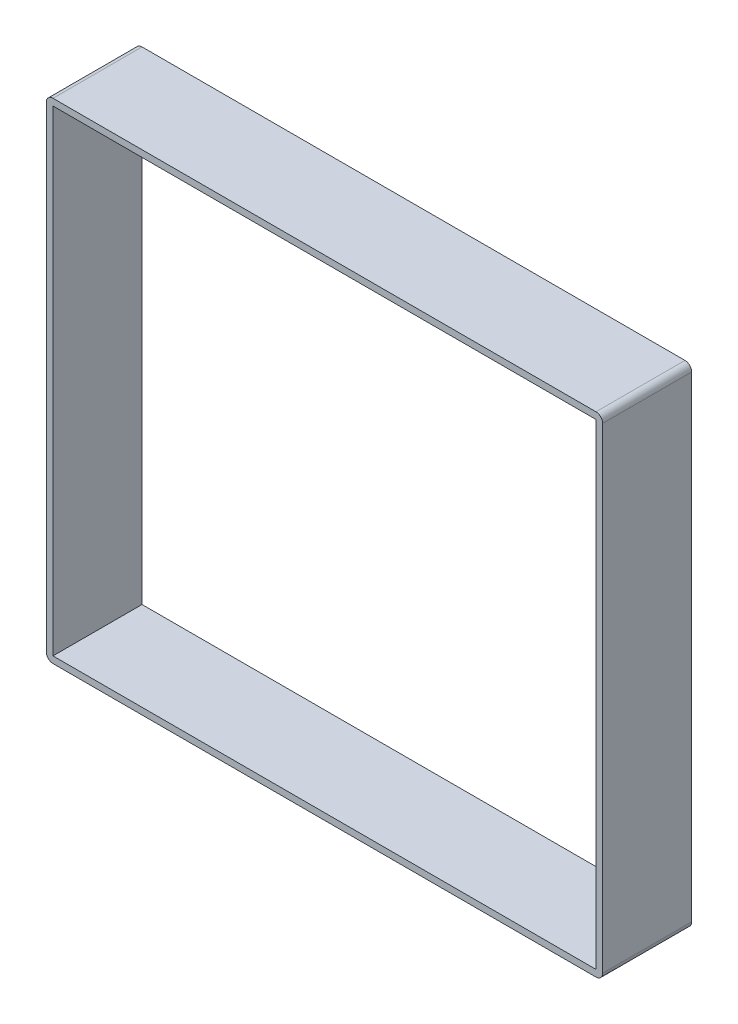
ISO-10303-21;
HEADER;
FILE_DESCRIPTION(('STEP AP214'),'2;1');
FILE_NAME('part.step','',(''),(''),'','','');
FILE_SCHEMA(('AUTOMOTIVE_DESIGN { 1 0 10303 214 1 1 1 1 }'));
ENDSEC;
DATA;
#1=APPLICATION_CONTEXT('core data for automotive mechanical design processes');
#2=APPLICATION_PROTOCOL_DEFINITION('international standard','automotive_design',2000,#1);
#3=PRODUCT_CONTEXT('',#1,'mechanical');
#4=PRODUCT('Part','Part','',(#3));
#5=PRODUCT_RELATED_PRODUCT_CATEGORY('part','',(#4));
#6=PRODUCT_DEFINITION_FORMATION('','',#4);
#7=PRODUCT_DEFINITION_CONTEXT('part definition',#1,'design');
#8=PRODUCT_DEFINITION('design','',#6,#7);
#9=PRODUCT_DEFINITION_SHAPE('','',#8);
#10=(LENGTH_UNIT() NAMED_UNIT(*) SI_UNIT(.MILLI.,.METRE.));
#11=(NAMED_UNIT(*) PLANE_ANGLE_UNIT() SI_UNIT($,.RADIAN.));
#12=(NAMED_UNIT(*) SI_UNIT($,.STERADIAN.) SOLID_ANGLE_UNIT());
#13=UNCERTAINTY_MEASURE_WITH_UNIT(LENGTH_MEASURE(1.E-05),#10,'distance_accuracy_value','');
#14=(GEOMETRIC_REPRESENTATION_CONTEXT(3) GLOBAL_UNCERTAINTY_ASSIGNED_CONTEXT((#13)) GLOBAL_UNIT_ASSIGNED_CONTEXT((#10,
#11,#12)) REPRESENTATION_CONTEXT('',''));
#15=CARTESIAN_POINT('',(0.,0.,0.));
#16=DIRECTION('',(0.,0.,1.));
#17=DIRECTION('',(1.,0.,0.));
#18=AXIS2_PLACEMENT_3D('',#15,#16,#17);
#19=CARTESIAN_POINT('',(0.,0.,40.));
#20=DIRECTION('',(0.,0.,1.));
#21=DIRECTION('',(1.,0.,0.));
#22=AXIS2_PLACEMENT_3D('',#19,#20,#21);
#23=PLANE('',#22);
#24=DIRECTION('',(0.,1.,0.));
#25=VECTOR('',#24,1.);
#26=CARTESIAN_POINT('',(160.461157825502,-30.145136030888,40.));
#27=LINE('',#26,#25);
#28=CARTESIAN_POINT('',(160.461157825502,-27.145136030888,40.));
#29=VERTEX_POINT('',#28);
#30=CARTESIAN_POINT('',(160.461157825502,186.854863969112,40.));
#31=VERTEX_POINT('',#30);
#32=EDGE_CURVE('E193',#29,#31,#27,.T.);
#33=ORIENTED_EDGE('',*,*,#32,.T.);
#34=CARTESIAN_POINT('',(157.461157825502,186.854863969112,40.));
#35=DIRECTION('',(0.,0.,1.));
#36=DIRECTION('',(1.,0.,0.));
#37=AXIS2_PLACEMENT_3D('',#34,#35,#36);
#38=CIRCLE('',#37,3.);
#39=CARTESIAN_POINT('',(157.461157825502,189.854863969112,40.));
#40=VERTEX_POINT('',#39);
#41=EDGE_CURVE('E236',#31,#40,#38,.T.);
#42=ORIENTED_EDGE('',*,*,#41,.T.);
#43=DIRECTION('',(-1.,0.,0.));
#44=VECTOR('',#43,1.);
#45=CARTESIAN_POINT('',(160.461157825502,189.854863969112,40.));
#46=LINE('',#45,#44);
#47=CARTESIAN_POINT('',(-86.5388421744983,189.854863969112,40.));
#48=VERTEX_POINT('',#47);
#49=EDGE_CURVE('E196',#40,#48,#46,.T.);
#50=ORIENTED_EDGE('',*,*,#49,.T.);
#51=CARTESIAN_POINT('',(-86.5388421744983,186.854863969112,40.));
#52=DIRECTION('',(0.,0.,1.));
#53=DIRECTION('',(1.,0.,0.));
#54=AXIS2_PLACEMENT_3D('',#51,#52,#53);
#55=CIRCLE('',#54,3.);
#56=CARTESIAN_POINT('',(-89.5388421744983,186.854863969112,40.));
#57=VERTEX_POINT('',#56);
#58=EDGE_CURVE('E234',#48,#57,#55,.T.);
#59=ORIENTED_EDGE('',*,*,#58,.T.);
#60=DIRECTION('',(0.,-1.,0.));
#61=VECTOR('',#60,1.);
#62=CARTESIAN_POINT('',(-89.5388421744983,-30.145136030888,40.));
#63=LINE('',#62,#61);
#64=CARTESIAN_POINT('',(-89.5388421744983,-27.145136030888,40.));
#65=VERTEX_POINT('',#64);
#66=EDGE_CURVE('E200',#57,#65,#63,.T.);
#67=ORIENTED_EDGE('',*,*,#66,.T.);
#68=CARTESIAN_POINT('',(-86.5388421744983,-27.145136030888,40.));
#69=DIRECTION('',(0.,0.,1.));
#70=DIRECTION('',(1.,0.,0.));
#71=AXIS2_PLACEMENT_3D('',#68,#69,#70);
#72=CIRCLE('',#71,3.);
#73=CARTESIAN_POINT('',(-86.5388421744983,-30.145136030888,40.));
#74=VERTEX_POINT('',#73);
#75=EDGE_CURVE('E82',#65,#74,#72,.T.);
#76=ORIENTED_EDGE('',*,*,#75,.T.);
#77=DIRECTION('',(1.,0.,0.));
#78=VECTOR('',#77,1.);
#79=CARTESIAN_POINT('',(160.461157825502,-30.145136030888,40.));
#80=LINE('',#79,#78);
#81=CARTESIAN_POINT('',(157.461157825502,-30.145136030888,40.));
#82=VERTEX_POINT('',#81);
#83=EDGE_CURVE('E202',#74,#82,#80,.T.);
#84=ORIENTED_EDGE('',*,*,#83,.T.);
#85=CARTESIAN_POINT('',(157.461157825502,-27.145136030888,40.));
#86=DIRECTION('',(0.,0.,1.));
#87=DIRECTION('',(1.,0.,0.));
#88=AXIS2_PLACEMENT_3D('',#85,#86,#87);
#89=CIRCLE('',#88,3.);
#90=EDGE_CURVE('E231',#82,#29,#89,.T.);
#91=ORIENTED_EDGE('',*,*,#90,.T.);
#92=EDGE_LOOP('',(#33,#42,#50,#59,#67,#76,#84,#91));
#93=FACE_BOUND('',#92,.T.);
#94=DIRECTION('',(-1.,0.,0.));
#95=VECTOR('',#94,1.);
#96=CARTESIAN_POINT('',(160.461157825502,186.854863969112,40.));
#97=LINE('',#96,#95);
#98=CARTESIAN_POINT('',(157.461157825502,186.854863969112,40.));
#99=VERTEX_POINT('',#98);
#100=CARTESIAN_POINT('',(-86.5388421744983,186.854863969112,40.));
#101=VERTEX_POINT('',#100);
#102=EDGE_CURVE('E162',#99,#101,#97,.T.);
#103=ORIENTED_EDGE('',*,*,#102,.F.);
#104=DIRECTION('',(0.,1.,0.));
#105=VECTOR('',#104,1.);
#106=CARTESIAN_POINT('',(157.461157825502,-30.145136030888,40.));
#107=LINE('',#106,#105);
#108=CARTESIAN_POINT('',(157.461157825502,-27.145136030888,40.));
#109=VERTEX_POINT('',#108);
#110=EDGE_CURVE('E152',#109,#99,#107,.T.);
#111=ORIENTED_EDGE('',*,*,#110,.F.);
#112=DIRECTION('',(1.,0.,0.));
#113=VECTOR('',#112,1.);
#114=CARTESIAN_POINT('',(160.461157825502,-27.145136030888,40.));
#115=LINE('',#114,#113);
#116=CARTESIAN_POINT('',(-86.5388421744983,-27.145136030888,40.));
#117=VERTEX_POINT('',#116);
#118=EDGE_CURVE('E177',#117,#109,#115,.T.);
#119=ORIENTED_EDGE('',*,*,#118,.F.);
#120=DIRECTION('',(0.,-1.,0.));
#121=VECTOR('',#120,1.);
#122=CARTESIAN_POINT('',(-86.5388421744983,-30.145136030888,40.));
#123=LINE('',#122,#121);
#124=EDGE_CURVE('E175',#101,#117,#123,.T.);
#125=ORIENTED_EDGE('',*,*,#124,.F.);
#126=EDGE_LOOP('',(#103,#111,#119,#125));
#127=FACE_BOUND('',#126,.T.);
#128=ADVANCED_FACE('F61',(#93,#127),#23,.T.);
#129=CARTESIAN_POINT('',(0.,0.,0.));
#130=DIRECTION('',(0.,0.,1.));
#131=DIRECTION('',(1.,0.,0.));
#132=AXIS2_PLACEMENT_3D('',#129,#130,#131);
#133=PLANE('',#132);
#134=DIRECTION('',(-1.,0.,0.));
#135=VECTOR('',#134,1.);
#136=CARTESIAN_POINT('',(160.461157825502,189.854863969112,0.));
#137=LINE('',#136,#135);
#138=CARTESIAN_POINT('',(157.461157825502,189.854863969112,0.));
#139=VERTEX_POINT('',#138);
#140=CARTESIAN_POINT('',(-86.5388421744983,189.854863969112,0.));
#141=VERTEX_POINT('',#140);
#142=EDGE_CURVE('E207',#139,#141,#137,.T.);
#143=ORIENTED_EDGE('',*,*,#142,.F.);
#144=CARTESIAN_POINT('',(157.461157825502,186.854863969112,0.));
#145=DIRECTION('',(0.,0.,1.));
#146=DIRECTION('',(1.,0.,0.));
#147=AXIS2_PLACEMENT_3D('',#144,#145,#146);
#148=CIRCLE('',#147,3.);
#149=CARTESIAN_POINT('',(160.461157825502,186.854863969112,0.));
#150=VERTEX_POINT('',#149);
#151=EDGE_CURVE('E224',#139,#150,#148,.F.);
#152=ORIENTED_EDGE('',*,*,#151,.T.);
#153=DIRECTION('',(0.,1.,0.));
#154=VECTOR('',#153,1.);
#155=CARTESIAN_POINT('',(160.461157825502,-30.145136030888,0.));
#156=LINE('',#155,#154);
#157=CARTESIAN_POINT('',(160.461157825502,-27.145136030888,0.));
#158=VERTEX_POINT('',#157);
#159=EDGE_CURVE('E170',#158,#150,#156,.T.);
#160=ORIENTED_EDGE('',*,*,#159,.F.);
#161=CARTESIAN_POINT('',(157.461157825502,-27.145136030888,0.));
#162=DIRECTION('',(0.,0.,1.));
#163=DIRECTION('',(1.,0.,0.));
#164=AXIS2_PLACEMENT_3D('',#161,#162,#163);
#165=CIRCLE('',#164,3.);
#166=CARTESIAN_POINT('',(157.461157825502,-30.145136030888,0.));
#167=VERTEX_POINT('',#166);
#168=EDGE_CURVE('E218',#158,#167,#165,.F.);
#169=ORIENTED_EDGE('',*,*,#168,.T.);
#170=DIRECTION('',(1.,0.,0.));
#171=VECTOR('',#170,1.);
#172=CARTESIAN_POINT('',(160.461157825502,-30.145136030888,0.));
#173=LINE('',#172,#171);
#174=CARTESIAN_POINT('',(-86.5388421744983,-30.145136030888,0.));
#175=VERTEX_POINT('',#174);
#176=EDGE_CURVE('E197',#175,#167,#173,.T.);
#177=ORIENTED_EDGE('',*,*,#176,.F.);
#178=CARTESIAN_POINT('',(-86.5388421744983,-27.145136030888,0.));
#179=DIRECTION('',(0.,0.,1.));
#180=DIRECTION('',(1.,0.,0.));
#181=AXIS2_PLACEMENT_3D('',#178,#179,#180);
#182=CIRCLE('',#181,3.);
#183=CARTESIAN_POINT('',(-89.5388421744983,-27.145136030888,0.));
#184=VERTEX_POINT('',#183);
#185=EDGE_CURVE('E220',#175,#184,#182,.F.);
#186=ORIENTED_EDGE('',*,*,#185,.T.);
#187=DIRECTION('',(0.,-1.,0.));
#188=VECTOR('',#187,1.);
#189=CARTESIAN_POINT('',(-89.5388421744983,-30.145136030888,0.));
#190=LINE('',#189,#188);
#191=CARTESIAN_POINT('',(-89.5388421744983,186.854863969112,0.));
#192=VERTEX_POINT('',#191);
#193=EDGE_CURVE('E210',#192,#184,#190,.T.);
#194=ORIENTED_EDGE('',*,*,#193,.F.);
#195=CARTESIAN_POINT('',(-86.5388421744983,186.854863969112,0.));
#196=DIRECTION('',(0.,0.,1.));
#197=DIRECTION('',(1.,0.,0.));
#198=AXIS2_PLACEMENT_3D('',#195,#196,#197);
#199=CIRCLE('',#198,3.);
#200=EDGE_CURVE('E222',#192,#141,#199,.F.);
#201=ORIENTED_EDGE('',*,*,#200,.T.);
#202=EDGE_LOOP('',(#143,#152,#160,#169,#177,#186,#194,#201));
#203=FACE_BOUND('',#202,.T.);
#204=DIRECTION('',(0.,1.,0.));
#205=VECTOR('',#204,1.);
#206=CARTESIAN_POINT('',(157.461157825502,-30.145136030888,0.));
#207=LINE('',#206,#205);
#208=CARTESIAN_POINT('',(157.461157825502,-27.145136030888,0.));
#209=VERTEX_POINT('',#208);
#210=CARTESIAN_POINT('',(157.461157825502,186.854863969112,0.));
#211=VERTEX_POINT('',#210);
#212=EDGE_CURVE('E181',#209,#211,#207,.T.);
#213=ORIENTED_EDGE('',*,*,#212,.T.);
#214=DIRECTION('',(-1.,0.,0.));
#215=VECTOR('',#214,1.);
#216=CARTESIAN_POINT('',(160.461157825502,186.854863969112,0.));
#217=LINE('',#216,#215);
#218=CARTESIAN_POINT('',(-86.5388421744983,186.854863969112,0.));
#219=VERTEX_POINT('',#218);
#220=EDGE_CURVE('E169',#211,#219,#217,.T.);
#221=ORIENTED_EDGE('',*,*,#220,.T.);
#222=DIRECTION('',(0.,-1.,0.));
#223=VECTOR('',#222,1.);
#224=CARTESIAN_POINT('',(-86.5388421744983,-30.145136030888,0.));
#225=LINE('',#224,#223);
#226=CARTESIAN_POINT('',(-86.5388421744983,-27.145136030888,0.));
#227=VERTEX_POINT('',#226);
#228=EDGE_CURVE('E184',#219,#227,#225,.T.);
#229=ORIENTED_EDGE('',*,*,#228,.T.);
#230=DIRECTION('',(1.,0.,0.));
#231=VECTOR('',#230,1.);
#232=CARTESIAN_POINT('',(160.461157825502,-27.145136030888,0.));
#233=LINE('',#232,#231);
#234=EDGE_CURVE('E163',#227,#209,#233,.T.);
#235=ORIENTED_EDGE('',*,*,#234,.T.);
#236=EDGE_LOOP('',(#213,#221,#229,#235));
#237=FACE_BOUND('',#236,.T.);
#238=ADVANCED_FACE('F252',(#203,#237),#133,.F.);
#239=CARTESIAN_POINT('',(160.461157825502,-30.145136030888,40.));
#240=DIRECTION('',(-1.,0.,0.));
#241=DIRECTION('',(0.,0.,1.));
#242=AXIS2_PLACEMENT_3D('',#239,#240,#241);
#243=PLANE('',#242);
#244=ORIENTED_EDGE('',*,*,#159,.T.);
#245=DIRECTION('',(0.,0.,-1.));
#246=VECTOR('',#245,1.);
#247=CARTESIAN_POINT('',(160.461157825502,186.854863969112,40.));
#248=LINE('',#247,#246);
#249=EDGE_CURVE('E229',#150,#31,#248,.F.);
#250=ORIENTED_EDGE('',*,*,#249,.T.);
#251=ORIENTED_EDGE('',*,*,#32,.F.);
#252=DIRECTION('',(0.,0.,-1.));
#253=VECTOR('',#252,1.);
#254=CARTESIAN_POINT('',(160.461157825502,-27.145136030888,40.));
#255=LINE('',#254,#253);
#256=EDGE_CURVE('E226',#29,#158,#255,.T.);
#257=ORIENTED_EDGE('',*,*,#256,.T.);
#258=EDGE_LOOP('',(#244,#250,#251,#257));
#259=FACE_BOUND('',#258,.T.);
#260=ADVANCED_FACE('F265',(#259),#243,.F.);
#261=CARTESIAN_POINT('',(160.461157825502,189.854863969112,40.));
#262=DIRECTION('',(0.,-1.,0.));
#263=DIRECTION('',(0.,0.,-1.));
#264=AXIS2_PLACEMENT_3D('',#261,#262,#263);
#265=PLANE('',#264);
#266=ORIENTED_EDGE('',*,*,#49,.F.);
#267=DIRECTION('',(0.,0.,-1.));
#268=VECTOR('',#267,1.);
#269=CARTESIAN_POINT('',(157.461157825502,189.854863969112,40.));
#270=LINE('',#269,#268);
#271=EDGE_CURVE('E215',#40,#139,#270,.T.);
#272=ORIENTED_EDGE('',*,*,#271,.T.);
#273=ORIENTED_EDGE('',*,*,#142,.T.);
#274=DIRECTION('',(0.,0.,-1.));
#275=VECTOR('',#274,1.);
#276=CARTESIAN_POINT('',(-86.5388421744983,189.854863969112,40.));
#277=LINE('',#276,#275);
#278=EDGE_CURVE('E204',#141,#48,#277,.F.);
#279=ORIENTED_EDGE('',*,*,#278,.T.);
#280=EDGE_LOOP('',(#266,#272,#273,#279));
#281=FACE_BOUND('',#280,.T.);
#282=ADVANCED_FACE('F273',(#281),#265,.F.);
#283=CARTESIAN_POINT('',(-89.5388421744983,-30.145136030888,40.));
#284=DIRECTION('',(1.,0.,0.));
#285=DIRECTION('',(0.,0.,-1.));
#286=AXIS2_PLACEMENT_3D('',#283,#284,#285);
#287=PLANE('',#286);
#288=ORIENTED_EDGE('',*,*,#66,.F.);
#289=DIRECTION('',(0.,0.,-1.));
#290=VECTOR('',#289,1.);
#291=CARTESIAN_POINT('',(-89.5388421744983,186.854863969112,40.));
#292=LINE('',#291,#290);
#293=EDGE_CURVE('E240',#57,#192,#292,.T.);
#294=ORIENTED_EDGE('',*,*,#293,.T.);
#295=ORIENTED_EDGE('',*,*,#193,.T.);
#296=DIRECTION('',(0.,0.,-1.));
#297=VECTOR('',#296,1.);
#298=CARTESIAN_POINT('',(-89.5388421744983,-27.145136030888,40.));
#299=LINE('',#298,#297);
#300=EDGE_CURVE('E238',#184,#65,#299,.F.);
#301=ORIENTED_EDGE('',*,*,#300,.T.);
#302=EDGE_LOOP('',(#288,#294,#295,#301));
#303=FACE_BOUND('',#302,.T.);
#304=ADVANCED_FACE('F246',(#303),#287,.F.);
#305=CARTESIAN_POINT('',(160.461157825502,-30.145136030888,40.));
#306=DIRECTION('',(0.,1.,0.));
#307=DIRECTION('',(0.,0.,1.));
#308=AXIS2_PLACEMENT_3D('',#305,#306,#307);
#309=PLANE('',#308);
#310=ORIENTED_EDGE('',*,*,#83,.F.);
#311=DIRECTION('',(0.,0.,-1.));
#312=VECTOR('',#311,1.);
#313=CARTESIAN_POINT('',(-86.5388421744983,-30.145136030888,40.));
#314=LINE('',#313,#312);
#315=EDGE_CURVE('E12',#74,#175,#314,.T.);
#316=ORIENTED_EDGE('',*,*,#315,.T.);
#317=ORIENTED_EDGE('',*,*,#176,.T.);
#318=DIRECTION('',(0.,0.,-1.));
#319=VECTOR('',#318,1.);
#320=CARTESIAN_POINT('',(157.461157825502,-30.145136030888,40.));
#321=LINE('',#320,#319);
#322=EDGE_CURVE('E69',#167,#82,#321,.F.);
#323=ORIENTED_EDGE('',*,*,#322,.T.);
#324=EDGE_LOOP('',(#310,#316,#317,#323));
#325=FACE_BOUND('',#324,.T.);
#326=ADVANCED_FACE('F258',(#325),#309,.F.);
#327=CARTESIAN_POINT('',(157.461157825502,-30.145136030888,40.));
#328=DIRECTION('',(-1.,0.,0.));
#329=DIRECTION('',(0.,0.,1.));
#330=AXIS2_PLACEMENT_3D('',#327,#328,#329);
#331=PLANE('',#330);
#332=ORIENTED_EDGE('',*,*,#212,.F.);
#333=DIRECTION('',(0.,0.,-1.));
#334=VECTOR('',#333,1.);
#335=CARTESIAN_POINT('',(157.461157825502,-27.145136030888,40.));
#336=LINE('',#335,#334);
#337=EDGE_CURVE('E158',#109,#209,#336,.T.);
#338=ORIENTED_EDGE('',*,*,#337,.F.);
#339=ORIENTED_EDGE('',*,*,#110,.T.);
#340=DIRECTION('',(0.,0.,-1.));
#341=VECTOR('',#340,1.);
#342=CARTESIAN_POINT('',(157.461157825502,186.854863969112,40.));
#343=LINE('',#342,#341);
#344=EDGE_CURVE('E155',#99,#211,#343,.T.);
#345=ORIENTED_EDGE('',*,*,#344,.T.);
#346=EDGE_LOOP('',(#332,#338,#339,#345));
#347=FACE_BOUND('',#346,.T.);
#348=ADVANCED_FACE('F154',(#347),#331,.T.);
#349=CARTESIAN_POINT('',(160.461157825502,186.854863969112,40.));
#350=DIRECTION('',(0.,-1.,0.));
#351=DIRECTION('',(0.,0.,-1.));
#352=AXIS2_PLACEMENT_3D('',#349,#350,#351);
#353=PLANE('',#352);
#354=ORIENTED_EDGE('',*,*,#220,.F.);
#355=ORIENTED_EDGE('',*,*,#344,.F.);
#356=ORIENTED_EDGE('',*,*,#102,.T.);
#357=DIRECTION('',(0.,0.,-1.));
#358=VECTOR('',#357,1.);
#359=CARTESIAN_POINT('',(-86.5388421744983,186.854863969112,40.));
#360=LINE('',#359,#358);
#361=EDGE_CURVE('E171',#101,#219,#360,.T.);
#362=ORIENTED_EDGE('',*,*,#361,.T.);
#363=EDGE_LOOP('',(#354,#355,#356,#362));
#364=FACE_BOUND('',#363,.T.);
#365=ADVANCED_FACE('F166',(#364),#353,.T.);
#366=CARTESIAN_POINT('',(-86.5388421744983,-30.145136030888,40.));
#367=DIRECTION('',(1.,0.,0.));
#368=DIRECTION('',(0.,0.,-1.));
#369=AXIS2_PLACEMENT_3D('',#366,#367,#368);
#370=PLANE('',#369);
#371=ORIENTED_EDGE('',*,*,#228,.F.);
#372=ORIENTED_EDGE('',*,*,#361,.F.);
#373=ORIENTED_EDGE('',*,*,#124,.T.);
#374=DIRECTION('',(0.,0.,-1.));
#375=VECTOR('',#374,1.);
#376=CARTESIAN_POINT('',(-86.5388421744983,-27.145136030888,40.));
#377=LINE('',#376,#375);
#378=EDGE_CURVE('E190',#117,#227,#377,.T.);
#379=ORIENTED_EDGE('',*,*,#378,.T.);
#380=EDGE_LOOP('',(#371,#372,#373,#379));
#381=FACE_BOUND('',#380,.T.);
#382=ADVANCED_FACE('F328',(#381),#370,.T.);
#383=CARTESIAN_POINT('',(160.461157825502,-27.145136030888,40.));
#384=DIRECTION('',(0.,1.,0.));
#385=DIRECTION('',(0.,0.,1.));
#386=AXIS2_PLACEMENT_3D('',#383,#384,#385);
#387=PLANE('',#386);
#388=ORIENTED_EDGE('',*,*,#234,.F.);
#389=ORIENTED_EDGE('',*,*,#378,.F.);
#390=ORIENTED_EDGE('',*,*,#118,.T.);
#391=ORIENTED_EDGE('',*,*,#337,.T.);
#392=EDGE_LOOP('',(#388,#389,#390,#391));
#393=FACE_BOUND('',#392,.T.);
#394=ADVANCED_FACE('F282',(#393),#387,.T.);
#395=CARTESIAN_POINT('',(157.461157825502,186.854863969112,40.));
#396=DIRECTION('',(0.,0.,-1.));
#397=DIRECTION('',(-1.,0.,0.));
#398=AXIS2_PLACEMENT_3D('',#395,#396,#397);
#399=CYLINDRICAL_SURFACE('',#398,3.);
#400=ORIENTED_EDGE('',*,*,#41,.F.);
#401=ORIENTED_EDGE('',*,*,#249,.F.);
#402=ORIENTED_EDGE('',*,*,#151,.F.);
#403=ORIENTED_EDGE('',*,*,#271,.F.);
#404=EDGE_LOOP('',(#400,#401,#402,#403));
#405=FACE_BOUND('',#404,.T.);
#406=ADVANCED_FACE('F270',(#405),#399,.T.);
#407=CARTESIAN_POINT('',(-86.5388421744983,186.854863969112,40.));
#408=DIRECTION('',(0.,0.,-1.));
#409=DIRECTION('',(-1.,0.,0.));
#410=AXIS2_PLACEMENT_3D('',#407,#408,#409);
#411=CYLINDRICAL_SURFACE('',#410,3.);
#412=ORIENTED_EDGE('',*,*,#58,.F.);
#413=ORIENTED_EDGE('',*,*,#278,.F.);
#414=ORIENTED_EDGE('',*,*,#200,.F.);
#415=ORIENTED_EDGE('',*,*,#293,.F.);
#416=EDGE_LOOP('',(#412,#413,#414,#415));
#417=FACE_BOUND('',#416,.T.);
#418=ADVANCED_FACE('F275',(#417),#411,.T.);
#419=CARTESIAN_POINT('',(-86.5388421744983,-27.145136030888,40.));
#420=DIRECTION('',(0.,0.,-1.));
#421=DIRECTION('',(-1.,0.,0.));
#422=AXIS2_PLACEMENT_3D('',#419,#420,#421);
#423=CYLINDRICAL_SURFACE('',#422,3.);
#424=ORIENTED_EDGE('',*,*,#75,.F.);
#425=ORIENTED_EDGE('',*,*,#300,.F.);
#426=ORIENTED_EDGE('',*,*,#185,.F.);
#427=ORIENTED_EDGE('',*,*,#315,.F.);
#428=EDGE_LOOP('',(#424,#425,#426,#427));
#429=FACE_BOUND('',#428,.T.);
#430=ADVANCED_FACE('F257',(#429),#423,.T.);
#431=CARTESIAN_POINT('',(157.461157825502,-27.145136030888,40.));
#432=DIRECTION('',(0.,0.,-1.));
#433=DIRECTION('',(-1.,0.,0.));
#434=AXIS2_PLACEMENT_3D('',#431,#432,#433);
#435=CYLINDRICAL_SURFACE('',#434,3.);
#436=ORIENTED_EDGE('',*,*,#90,.F.);
#437=ORIENTED_EDGE('',*,*,#322,.F.);
#438=ORIENTED_EDGE('',*,*,#168,.F.);
#439=ORIENTED_EDGE('',*,*,#256,.F.);
#440=EDGE_LOOP('',(#436,#437,#438,#439));
#441=FACE_BOUND('',#440,.T.);
#442=ADVANCED_FACE('F63',(#441),#435,.T.);
#443=CLOSED_SHELL('',(#128,#238,#260,#282,#304,#326,#348,#365,#382,#394,#406,#418,#430,#442));
#444=MANIFOLD_SOLID_BREP('B2',#443);
#445=ADVANCED_BREP_SHAPE_REPRESENTATION('',(#18,#444),#14);
#446=SHAPE_DEFINITION_REPRESENTATION(#9,#445);
ENDSEC;
END-ISO-10303-21;
